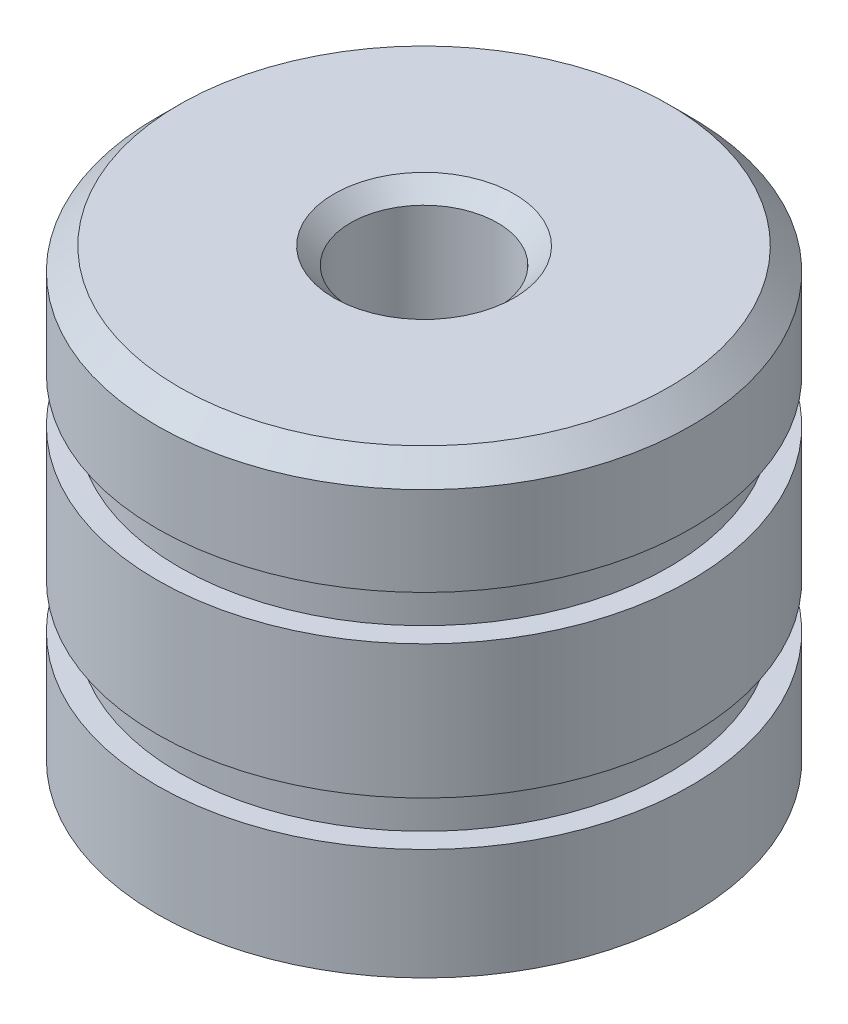
ISO-10303-21;
HEADER;
FILE_DESCRIPTION(('STEP AP214'),'2;1');
FILE_NAME('part.step','',(''),(''),'','','');
FILE_SCHEMA(('AUTOMOTIVE_DESIGN { 1 0 10303 214 1 1 1 1 }'));
ENDSEC;
DATA;
#1=APPLICATION_CONTEXT('core data for automotive mechanical design processes');
#2=APPLICATION_PROTOCOL_DEFINITION('international standard','automotive_design',2000,#1);
#3=PRODUCT_CONTEXT('',#1,'mechanical');
#4=PRODUCT('Part','Part','',(#3));
#5=PRODUCT_RELATED_PRODUCT_CATEGORY('part','',(#4));
#6=PRODUCT_DEFINITION_FORMATION('','',#4);
#7=PRODUCT_DEFINITION_CONTEXT('part definition',#1,'design');
#8=PRODUCT_DEFINITION('design','',#6,#7);
#9=PRODUCT_DEFINITION_SHAPE('','',#8);
#10=(LENGTH_UNIT() NAMED_UNIT(*) SI_UNIT(.MILLI.,.METRE.));
#11=(NAMED_UNIT(*) PLANE_ANGLE_UNIT() SI_UNIT($,.RADIAN.));
#12=(NAMED_UNIT(*) SI_UNIT($,.STERADIAN.) SOLID_ANGLE_UNIT());
#13=UNCERTAINTY_MEASURE_WITH_UNIT(LENGTH_MEASURE(1.E-05),#10,'distance_accuracy_value','');
#14=(GEOMETRIC_REPRESENTATION_CONTEXT(3) GLOBAL_UNCERTAINTY_ASSIGNED_CONTEXT((#13)) GLOBAL_UNIT_ASSIGNED_CONTEXT((#10,
#11,#12)) REPRESENTATION_CONTEXT('',''));
#15=CARTESIAN_POINT('',(0.,0.,0.));
#16=DIRECTION('',(0.,0.,1.));
#17=DIRECTION('',(1.,0.,0.));
#18=AXIS2_PLACEMENT_3D('',#15,#16,#17);
#19=CARTESIAN_POINT('',(0.,5.,0.));
#20=DIRECTION('',(0.,-1.,0.));
#21=DIRECTION('',(0.,0.,-1.));
#22=AXIS2_PLACEMENT_3D('',#19,#20,#21);
#23=CYLINDRICAL_SURFACE('',#22,6.);
#24=CARTESIAN_POINT('',(0.,1.5,0.));
#25=DIRECTION('',(0.,1.,0.));
#26=DIRECTION('',(0.,0.,1.));
#27=AXIS2_PLACEMENT_3D('',#24,#25,#26);
#28=CIRCLE('',#27,6.);
#29=CARTESIAN_POINT('',(0.,1.5,6.));
#30=VERTEX_POINT('',#29);
#31=EDGE_CURVE('E80',#30,#30,#28,.T.);
#32=ORIENTED_EDGE('',*,*,#31,.F.);
#33=EDGE_LOOP('',(#32));
#34=FACE_BOUND('',#33,.T.);
#35=CARTESIAN_POINT('',(0.,-1.5,0.));
#36=DIRECTION('',(0.,1.,0.));
#37=DIRECTION('',(0.,0.,1.));
#38=AXIS2_PLACEMENT_3D('',#35,#36,#37);
#39=CIRCLE('',#38,6.);
#40=CARTESIAN_POINT('',(0.,-1.5,6.));
#41=VERTEX_POINT('',#40);
#42=EDGE_CURVE('E68',#41,#41,#39,.T.);
#43=ORIENTED_EDGE('',*,*,#42,.T.);
#44=EDGE_LOOP('',(#43));
#45=FACE_BOUND('',#44,.T.);
#46=ADVANCED_FACE('F35',(#34,#45),#23,.T.);
#47=CARTESIAN_POINT('',(0.,1.5,0.));
#48=DIRECTION('',(0.,1.,0.));
#49=DIRECTION('',(0.,0.,1.));
#50=AXIS2_PLACEMENT_3D('',#47,#48,#49);
#51=PLANE('',#50);
#52=CARTESIAN_POINT('',(0.,1.5,0.));
#53=DIRECTION('',(0.,1.,0.));
#54=DIRECTION('',(0.,0.,1.));
#55=AXIS2_PLACEMENT_3D('',#52,#53,#54);
#56=CIRCLE('',#55,5.5);
#57=CARTESIAN_POINT('',(0.,1.5,5.5));
#58=VERTEX_POINT('',#57);
#59=EDGE_CURVE('E74',#58,#58,#56,.T.);
#60=ORIENTED_EDGE('',*,*,#59,.F.);
#61=EDGE_LOOP('',(#60));
#62=FACE_BOUND('',#61,.T.);
#63=ORIENTED_EDGE('',*,*,#31,.T.);
#64=EDGE_LOOP('',(#63));
#65=FACE_BOUND('',#64,.T.);
#66=ADVANCED_FACE('F103',(#62,#65),#51,.T.);
#67=CARTESIAN_POINT('',(0.,2.5,0.));
#68=DIRECTION('',(0.,1.,0.));
#69=DIRECTION('',(0.,0.,1.));
#70=AXIS2_PLACEMENT_3D('',#67,#68,#69);
#71=PLANE('',#70);
#72=CARTESIAN_POINT('',(0.,2.5,0.));
#73=DIRECTION('',(0.,1.,0.));
#74=DIRECTION('',(0.,0.,1.));
#75=AXIS2_PLACEMENT_3D('',#72,#73,#74);
#76=CIRCLE('',#75,5.5);
#77=CARTESIAN_POINT('',(0.,2.5,5.5));
#78=VERTEX_POINT('',#77);
#79=EDGE_CURVE('E71',#78,#78,#76,.T.);
#80=ORIENTED_EDGE('',*,*,#79,.T.);
#81=EDGE_LOOP('',(#80));
#82=FACE_BOUND('',#81,.T.);
#83=CARTESIAN_POINT('',(0.,2.5,0.));
#84=DIRECTION('',(0.,1.,0.));
#85=DIRECTION('',(0.,0.,1.));
#86=AXIS2_PLACEMENT_3D('',#83,#84,#85);
#87=CIRCLE('',#86,6.);
#88=CARTESIAN_POINT('',(0.,2.5,6.));
#89=VERTEX_POINT('',#88);
#90=EDGE_CURVE('E77',#89,#89,#87,.T.);
#91=ORIENTED_EDGE('',*,*,#90,.F.);
#92=EDGE_LOOP('',(#91));
#93=FACE_BOUND('',#92,.T.);
#94=ADVANCED_FACE('F108',(#82,#93),#71,.F.);
#95=CARTESIAN_POINT('',(0.,1.5,0.));
#96=DIRECTION('',(0.,1.,0.));
#97=DIRECTION('',(0.,0.,1.));
#98=AXIS2_PLACEMENT_3D('',#95,#96,#97);
#99=CYLINDRICAL_SURFACE('',#98,5.5);
#100=ORIENTED_EDGE('',*,*,#59,.T.);
#101=EDGE_LOOP('',(#100));
#102=FACE_BOUND('',#101,.T.);
#103=ORIENTED_EDGE('',*,*,#79,.F.);
#104=EDGE_LOOP('',(#103));
#105=FACE_BOUND('',#104,.T.);
#106=ADVANCED_FACE('F124',(#102,#105),#99,.T.);
#107=CARTESIAN_POINT('',(0.,5.,0.));
#108=DIRECTION('',(0.,1.,0.));
#109=DIRECTION('',(0.,0.,1.));
#110=AXIS2_PLACEMENT_3D('',#107,#108,#109);
#111=PLANE('',#110);
#112=CARTESIAN_POINT('',(0.,5.,0.));
#113=DIRECTION('',(0.,1.,0.));
#114=DIRECTION('',(0.,0.,1.));
#115=AXIS2_PLACEMENT_3D('',#112,#113,#114);
#116=CIRCLE('',#115,2.025);
#117=CARTESIAN_POINT('',(0.,5.,2.025));
#118=VERTEX_POINT('',#117);
#119=EDGE_CURVE('E61',#118,#118,#116,.T.);
#120=ORIENTED_EDGE('',*,*,#119,.F.);
#121=EDGE_LOOP('',(#120));
#122=FACE_BOUND('',#121,.T.);
#123=CARTESIAN_POINT('',(0.,5.,0.));
#124=DIRECTION('',(0.,1.,0.));
#125=DIRECTION('',(0.,0.,1.));
#126=AXIS2_PLACEMENT_3D('',#123,#124,#125);
#127=CIRCLE('',#126,5.50000000000001);
#128=CARTESIAN_POINT('',(0.,5.,5.50000000000001));
#129=VERTEX_POINT('',#128);
#130=EDGE_CURVE('E42',#129,#129,#127,.T.);
#131=ORIENTED_EDGE('',*,*,#130,.T.);
#132=EDGE_LOOP('',(#131));
#133=FACE_BOUND('',#132,.T.);
#134=ADVANCED_FACE('F90',(#122,#133),#111,.T.);
#135=CARTESIAN_POINT('',(0.,4.5,0.));
#136=DIRECTION('',(0.,1.,0.));
#137=DIRECTION('',(0.,0.,1.));
#138=AXIS2_PLACEMENT_3D('',#135,#136,#137);
#139=CIRCLE('',#138,6.);
#140=CARTESIAN_POINT('',(0.,4.5,6.));
#141=VERTEX_POINT('',#140);
#142=EDGE_CURVE('E11',#141,#141,#139,.F.);
#143=ORIENTED_EDGE('',*,*,#142,.T.);
#144=EDGE_LOOP('',(#143));
#145=FACE_BOUND('',#144,.T.);
#146=ORIENTED_EDGE('',*,*,#90,.T.);
#147=EDGE_LOOP('',(#146));
#148=FACE_BOUND('',#147,.T.);
#149=ADVANCED_FACE('F100',(#145,#148),#23,.T.);
#150=CARTESIAN_POINT('',(0.,-1.5,0.));
#151=DIRECTION('',(0.,-1.,0.));
#152=DIRECTION('',(0.,0.,1.));
#153=AXIS2_PLACEMENT_3D('',#150,#151,#152);
#154=PLANE('',#153);
#155=ORIENTED_EDGE('',*,*,#42,.F.);
#156=EDGE_LOOP('',(#155));
#157=FACE_BOUND('',#156,.T.);
#158=CARTESIAN_POINT('',(0.,-1.5,0.));
#159=DIRECTION('',(0.,1.,0.));
#160=DIRECTION('',(0.,0.,1.));
#161=AXIS2_PLACEMENT_3D('',#158,#159,#160);
#162=CIRCLE('',#161,5.5);
#163=CARTESIAN_POINT('',(0.,-1.5,5.5));
#164=VERTEX_POINT('',#163);
#165=EDGE_CURVE('E58',#164,#164,#162,.T.);
#166=ORIENTED_EDGE('',*,*,#165,.T.);
#167=EDGE_LOOP('',(#166));
#168=FACE_BOUND('',#167,.T.);
#169=ADVANCED_FACE('F115',(#157,#168),#154,.T.);
#170=CARTESIAN_POINT('',(0.,-2.5,0.));
#171=DIRECTION('',(0.,-1.,0.));
#172=DIRECTION('',(0.,0.,1.));
#173=AXIS2_PLACEMENT_3D('',#170,#171,#172);
#174=PLANE('',#173);
#175=CARTESIAN_POINT('',(0.,-2.5,0.));
#176=DIRECTION('',(0.,1.,0.));
#177=DIRECTION('',(0.,0.,1.));
#178=AXIS2_PLACEMENT_3D('',#175,#176,#177);
#179=CIRCLE('',#178,6.);
#180=CARTESIAN_POINT('',(0.,-2.5,6.));
#181=VERTEX_POINT('',#180);
#182=EDGE_CURVE('E66',#181,#181,#179,.T.);
#183=ORIENTED_EDGE('',*,*,#182,.T.);
#184=EDGE_LOOP('',(#183));
#185=FACE_BOUND('',#184,.T.);
#186=CARTESIAN_POINT('',(0.,-2.5,0.));
#187=DIRECTION('',(0.,1.,0.));
#188=DIRECTION('',(0.,0.,1.));
#189=AXIS2_PLACEMENT_3D('',#186,#187,#188);
#190=CIRCLE('',#189,5.5);
#191=CARTESIAN_POINT('',(0.,-2.5,5.5));
#192=VERTEX_POINT('',#191);
#193=EDGE_CURVE('E54',#192,#192,#190,.T.);
#194=ORIENTED_EDGE('',*,*,#193,.F.);
#195=EDGE_LOOP('',(#194));
#196=FACE_BOUND('',#195,.T.);
#197=ADVANCED_FACE('F121',(#185,#196),#174,.F.);
#198=CARTESIAN_POINT('',(0.,-1.5,0.));
#199=DIRECTION('',(0.,-1.,0.));
#200=DIRECTION('',(0.,0.,-1.));
#201=AXIS2_PLACEMENT_3D('',#198,#199,#200);
#202=CYLINDRICAL_SURFACE('',#201,5.5);
#203=ORIENTED_EDGE('',*,*,#165,.F.);
#204=EDGE_LOOP('',(#203));
#205=FACE_BOUND('',#204,.T.);
#206=ORIENTED_EDGE('',*,*,#193,.T.);
#207=EDGE_LOOP('',(#206));
#208=FACE_BOUND('',#207,.T.);
#209=ADVANCED_FACE('F139',(#205,#208),#202,.T.);
#210=CARTESIAN_POINT('',(0.,-5.,0.));
#211=DIRECTION('',(0.,1.,0.));
#212=DIRECTION('',(0.,0.,1.));
#213=AXIS2_PLACEMENT_3D('',#210,#211,#212);
#214=PLANE('',#213);
#215=CARTESIAN_POINT('',(0.,-5.,0.));
#216=DIRECTION('',(0.,1.,0.));
#217=DIRECTION('',(0.,0.,1.));
#218=AXIS2_PLACEMENT_3D('',#215,#216,#217);
#219=CIRCLE('',#218,6.);
#220=CARTESIAN_POINT('',(0.,-5.,6.));
#221=VERTEX_POINT('',#220);
#222=EDGE_CURVE('E83',#221,#221,#219,.T.);
#223=ORIENTED_EDGE('',*,*,#222,.F.);
#224=EDGE_LOOP('',(#223));
#225=FACE_BOUND('',#224,.T.);
#226=ADVANCED_FACE('F98',(#225),#214,.F.);
#227=ORIENTED_EDGE('',*,*,#182,.F.);
#228=EDGE_LOOP('',(#227));
#229=FACE_BOUND('',#228,.T.);
#230=ORIENTED_EDGE('',*,*,#222,.T.);
#231=EDGE_LOOP('',(#230));
#232=FACE_BOUND('',#231,.T.);
#233=ADVANCED_FACE('F93',(#229,#232),#23,.T.);
#234=CARTESIAN_POINT('',(0.,5.,0.));
#235=DIRECTION('',(0.,-1.,0.));
#236=DIRECTION('',(0.,0.,-1.));
#237=AXIS2_PLACEMENT_3D('',#234,#235,#236);
#238=CONICAL_SURFACE('',#237,5.50000000000001,0.785398163397444);
#239=ORIENTED_EDGE('',*,*,#142,.F.);
#240=EDGE_LOOP('',(#239));
#241=FACE_BOUND('',#240,.T.);
#242=ORIENTED_EDGE('',*,*,#130,.F.);
#243=EDGE_LOOP('',(#242));
#244=FACE_BOUND('',#243,.T.);
#245=ADVANCED_FACE('F37',(#241,#244),#238,.T.);
#246=CARTESIAN_POINT('',(0.,-3.,0.));
#247=DIRECTION('',(0.,1.,0.));
#248=DIRECTION('',(0.,0.,1.));
#249=AXIS2_PLACEMENT_3D('',#246,#247,#248);
#250=CONICAL_SURFACE('',#249,1.65,1.02974425867665);
#251=CARTESIAN_POINT('',(0.,-3.99142002139548,0.));
#252=VERTEX_POINT('',#251);
#253=VERTEX_LOOP('',#252);
#254=FACE_BOUND('',#253,.T.);
#255=CARTESIAN_POINT('',(0.,-3.,0.));
#256=DIRECTION('',(0.,1.,0.));
#257=DIRECTION('',(0.,0.,1.));
#258=AXIS2_PLACEMENT_3D('',#255,#256,#257);
#259=CIRCLE('',#258,1.65);
#260=CARTESIAN_POINT('',(0.,-3.,1.65));
#261=VERTEX_POINT('',#260);
#262=EDGE_CURVE('E52',#261,#261,#259,.T.);
#263=ORIENTED_EDGE('',*,*,#262,.T.);
#264=EDGE_LOOP('',(#263));
#265=FACE_BOUND('',#264,.T.);
#266=ADVANCED_FACE('F45',(#254,#265),#250,.F.);
#267=CARTESIAN_POINT('',(0.,5.,0.));
#268=DIRECTION('',(0.,1.,0.));
#269=DIRECTION('',(0.,0.,1.));
#270=AXIS2_PLACEMENT_3D('',#267,#268,#269);
#271=CYLINDRICAL_SURFACE('',#270,1.65);
#272=ORIENTED_EDGE('',*,*,#262,.F.);
#273=EDGE_LOOP('',(#272));
#274=FACE_BOUND('',#273,.T.);
#275=CARTESIAN_POINT('',(0.,4.625,0.));
#276=DIRECTION('',(0.,1.,0.));
#277=DIRECTION('',(0.,0.,1.));
#278=AXIS2_PLACEMENT_3D('',#275,#276,#277);
#279=CIRCLE('',#278,1.65);
#280=CARTESIAN_POINT('',(0.,4.625,1.65));
#281=VERTEX_POINT('',#280);
#282=EDGE_CURVE('E55',#281,#281,#279,.T.);
#283=ORIENTED_EDGE('',*,*,#282,.T.);
#284=EDGE_LOOP('',(#283));
#285=FACE_BOUND('',#284,.T.);
#286=ADVANCED_FACE('F48',(#274,#285),#271,.F.);
#287=CARTESIAN_POINT('',(0.,5.,0.));
#288=DIRECTION('',(0.,1.,0.));
#289=DIRECTION('',(0.,0.,1.));
#290=AXIS2_PLACEMENT_3D('',#287,#288,#289);
#291=CONICAL_SURFACE('',#290,2.025,0.785398163397446);
#292=ORIENTED_EDGE('',*,*,#282,.F.);
#293=EDGE_LOOP('',(#292));
#294=FACE_BOUND('',#293,.T.);
#295=ORIENTED_EDGE('',*,*,#119,.T.);
#296=EDGE_LOOP('',(#295));
#297=FACE_BOUND('',#296,.T.);
#298=ADVANCED_FACE('F158',(#294,#297),#291,.F.);
#299=CLOSED_SHELL('',(#46,#66,#94,#106,#134,#149,#169,#197,#209,#226,#233,#245,#266,#286,#298));
#300=MANIFOLD_SOLID_BREP('B2',#299);
#301=ADVANCED_BREP_SHAPE_REPRESENTATION('',(#18,#300),#14);
#302=SHAPE_DEFINITION_REPRESENTATION(#9,#301);
ENDSEC;
END-ISO-10303-21;
